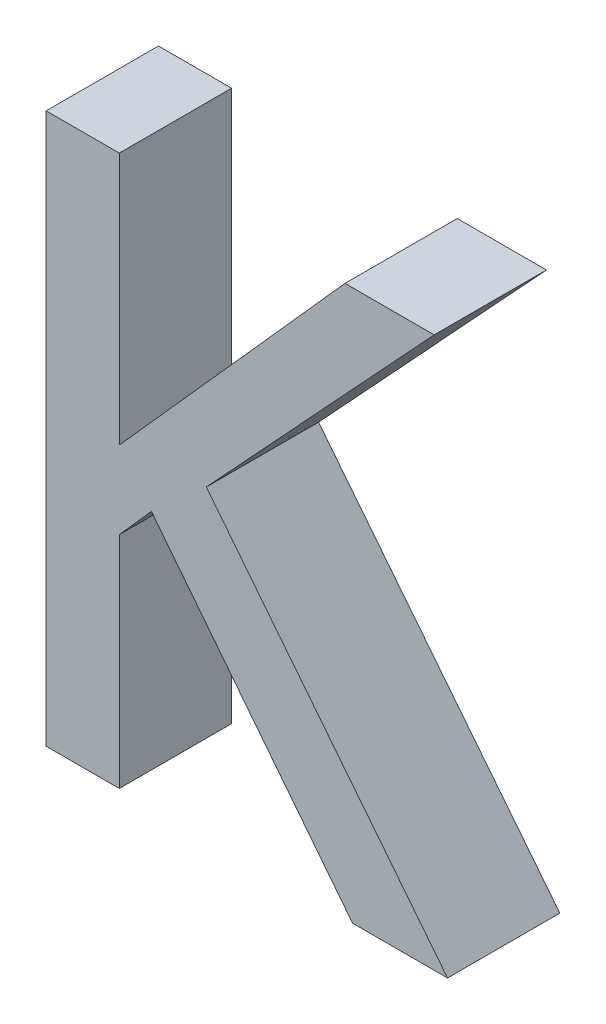
ISO-10303-21;
HEADER;
FILE_DESCRIPTION(('STEP AP214'),'2;1');
FILE_NAME('part.step','',(''),(''),'','','');
FILE_SCHEMA(('AUTOMOTIVE_DESIGN { 1 0 10303 214 1 1 1 1 }'));
ENDSEC;
DATA;
#1=APPLICATION_CONTEXT('core data for automotive mechanical design processes');
#2=APPLICATION_PROTOCOL_DEFINITION('international standard','automotive_design',2000,#1);
#3=PRODUCT_CONTEXT('',#1,'mechanical');
#4=PRODUCT('Part','Part','',(#3));
#5=PRODUCT_RELATED_PRODUCT_CATEGORY('part','',(#4));
#6=PRODUCT_DEFINITION_FORMATION('','',#4);
#7=PRODUCT_DEFINITION_CONTEXT('part definition',#1,'design');
#8=PRODUCT_DEFINITION('design','',#6,#7);
#9=PRODUCT_DEFINITION_SHAPE('','',#8);
#10=(LENGTH_UNIT() NAMED_UNIT(*) SI_UNIT(.MILLI.,.METRE.));
#11=(NAMED_UNIT(*) PLANE_ANGLE_UNIT() SI_UNIT($,.RADIAN.));
#12=(NAMED_UNIT(*) SI_UNIT($,.STERADIAN.) SOLID_ANGLE_UNIT());
#13=UNCERTAINTY_MEASURE_WITH_UNIT(LENGTH_MEASURE(1.E-05),#10,'distance_accuracy_value','');
#14=(GEOMETRIC_REPRESENTATION_CONTEXT(3) GLOBAL_UNCERTAINTY_ASSIGNED_CONTEXT((#13)) GLOBAL_UNIT_ASSIGNED_CONTEXT((#10,
#11,#12)) REPRESENTATION_CONTEXT('',''));
#15=CARTESIAN_POINT('',(0.,0.,0.));
#16=DIRECTION('',(0.,0.,1.));
#17=DIRECTION('',(1.,0.,0.));
#18=AXIS2_PLACEMENT_3D('',#15,#16,#17);
#19=CARTESIAN_POINT('',(-0.0746386260347803,-1.099105900586,0.));
#20=DIRECTION('',(-0.786318338822423,-0.617821551931904,0.));
#21=DIRECTION('',(0.617821551931904,-0.786318338822423,0.));
#22=AXIS2_PLACEMENT_3D('',#19,#20,#21);
#23=PLANE('',#22);
#24=DIRECTION('',(-0.617821551931904,0.786318338822423,0.));
#25=VECTOR('',#24,1.);
#26=CARTESIAN_POINT('',(0.104445648049852,-1.32703134033,0.));
#27=LINE('',#26,#25);
#28=CARTESIAN_POINT('',(0.104445648049852,-1.32703134033,0.));
#29=VERTEX_POINT('',#28);
#30=CARTESIAN_POINT('',(-0.0746386260347803,-1.099105900586,0.));
#31=VERTEX_POINT('',#30);
#32=EDGE_CURVE('E11',#29,#31,#27,.T.);
#33=ORIENTED_EDGE('',*,*,#32,.F.);
#34=DIRECTION('',(0.,0.,1.));
#35=VECTOR('',#34,1.);
#36=CARTESIAN_POINT('',(0.104445648049852,-1.32703134033,0.));
#37=LINE('',#36,#35);
#38=CARTESIAN_POINT('',(0.104445648049852,-1.32703134033,0.1));
#39=VERTEX_POINT('',#38);
#40=EDGE_CURVE('E24',#29,#39,#37,.T.);
#41=ORIENTED_EDGE('',*,*,#40,.T.);
#42=DIRECTION('',(0.617821551931904,-0.786318338822423,0.));
#43=VECTOR('',#42,1.);
#44=CARTESIAN_POINT('',(0.104445648049852,-1.32703134033,0.1));
#45=LINE('',#44,#43);
#46=CARTESIAN_POINT('',(-0.0746386260347803,-1.099105900586,0.1));
#47=VERTEX_POINT('',#46);
#48=EDGE_CURVE('E124',#47,#39,#45,.T.);
#49=ORIENTED_EDGE('',*,*,#48,.F.);
#50=DIRECTION('',(0.,0.,1.));
#51=VECTOR('',#50,1.);
#52=CARTESIAN_POINT('',(-0.0746386260347803,-1.099105900586,0.));
#53=LINE('',#52,#51);
#54=EDGE_CURVE('E197',#31,#47,#53,.T.);
#55=ORIENTED_EDGE('',*,*,#54,.F.);
#56=EDGE_LOOP('',(#33,#41,#49,#55));
#57=FACE_BOUND('',#56,.T.);
#58=ADVANCED_FACE('F17',(#57),#23,.T.);
#59=CARTESIAN_POINT('',(-0.103228576664699,-1.131269595045,0.));
#60=DIRECTION('',(0.747409318683659,-0.664363838829921,0.));
#61=DIRECTION('',(0.664363838829921,0.747409318683659,0.));
#62=AXIS2_PLACEMENT_3D('',#59,#60,#61);
#63=PLANE('',#62);
#64=DIRECTION('',(-0.664363838829921,-0.747409318683659,0.));
#65=VECTOR('',#64,1.);
#66=CARTESIAN_POINT('',(-0.0746386260347803,-1.099105900586,0.));
#67=LINE('',#66,#65);
#68=CARTESIAN_POINT('',(-0.103228576664699,-1.131269595045,0.));
#69=VERTEX_POINT('',#68);
#70=EDGE_CURVE('E195',#31,#69,#67,.T.);
#71=ORIENTED_EDGE('',*,*,#70,.F.);
#72=ORIENTED_EDGE('',*,*,#54,.T.);
#73=DIRECTION('',(0.664363838829921,0.747409318683659,0.));
#74=VECTOR('',#73,1.);
#75=CARTESIAN_POINT('',(-0.0746386260347803,-1.099105900586,0.1));
#76=LINE('',#75,#74);
#77=CARTESIAN_POINT('',(-0.103228576664699,-1.131269595045,0.1));
#78=VERTEX_POINT('',#77);
#79=EDGE_CURVE('E193',#78,#47,#76,.T.);
#80=ORIENTED_EDGE('',*,*,#79,.F.);
#81=DIRECTION('',(0.,0.,1.));
#82=VECTOR('',#81,1.);
#83=CARTESIAN_POINT('',(-0.103228576664699,-1.131269595045,0.));
#84=LINE('',#83,#82);
#85=EDGE_CURVE('E190',#69,#78,#84,.T.);
#86=ORIENTED_EDGE('',*,*,#85,.F.);
#87=EDGE_LOOP('',(#71,#72,#80,#86));
#88=FACE_BOUND('',#87,.T.);
#89=ADVANCED_FACE('F235',(#88),#63,.T.);
#90=CARTESIAN_POINT('',(-0.103228576664699,-1.32703134033,0.));
#91=DIRECTION('',(1.,0.,0.));
#92=DIRECTION('',(0.,1.,0.));
#93=AXIS2_PLACEMENT_3D('',#90,#91,#92);
#94=PLANE('',#93);
#95=DIRECTION('',(0.,-1.,0.));
#96=VECTOR('',#95,1.);
#97=CARTESIAN_POINT('',(-0.103228576664699,-1.131269595045,0.));
#98=LINE('',#97,#96);
#99=CARTESIAN_POINT('',(-0.103228576664699,-1.32703134033,0.));
#100=VERTEX_POINT('',#99);
#101=EDGE_CURVE('E188',#69,#100,#98,.T.);
#102=ORIENTED_EDGE('',*,*,#101,.F.);
#103=ORIENTED_EDGE('',*,*,#85,.T.);
#104=DIRECTION('',(0.,1.,0.));
#105=VECTOR('',#104,1.);
#106=CARTESIAN_POINT('',(-0.103228576664699,-1.131269595045,0.1));
#107=LINE('',#106,#105);
#108=CARTESIAN_POINT('',(-0.103228576664699,-1.32703134033,0.1));
#109=VERTEX_POINT('',#108);
#110=EDGE_CURVE('E185',#109,#78,#107,.T.);
#111=ORIENTED_EDGE('',*,*,#110,.F.);
#112=DIRECTION('',(0.,0.,1.));
#113=VECTOR('',#112,1.);
#114=CARTESIAN_POINT('',(-0.103228576664699,-1.32703134033,0.));
#115=LINE('',#114,#113);
#116=EDGE_CURVE('E182',#100,#109,#115,.T.);
#117=ORIENTED_EDGE('',*,*,#116,.F.);
#118=EDGE_LOOP('',(#102,#103,#111,#117));
#119=FACE_BOUND('',#118,.T.);
#120=ADVANCED_FACE('F231',(#119),#94,.T.);
#121=CARTESIAN_POINT('',(-0.168350130877293,-1.32703134033,0.));
#122=DIRECTION('',(0.,-1.,0.));
#123=DIRECTION('',(1.,0.,0.));
#124=AXIS2_PLACEMENT_3D('',#121,#122,#123);
#125=PLANE('',#124);
#126=DIRECTION('',(-1.,0.,0.));
#127=VECTOR('',#126,1.);
#128=CARTESIAN_POINT('',(-0.103228576664699,-1.32703134033,0.));
#129=LINE('',#128,#127);
#130=CARTESIAN_POINT('',(-0.168350130877293,-1.32703134033,0.));
#131=VERTEX_POINT('',#130);
#132=EDGE_CURVE('E180',#100,#131,#129,.T.);
#133=ORIENTED_EDGE('',*,*,#132,.F.);
#134=ORIENTED_EDGE('',*,*,#116,.T.);
#135=DIRECTION('',(1.,0.,0.));
#136=VECTOR('',#135,1.);
#137=CARTESIAN_POINT('',(-0.103228576664699,-1.32703134033,0.1));
#138=LINE('',#137,#136);
#139=CARTESIAN_POINT('',(-0.168350130877293,-1.32703134033,0.1));
#140=VERTEX_POINT('',#139);
#141=EDGE_CURVE('E177',#140,#109,#138,.T.);
#142=ORIENTED_EDGE('',*,*,#141,.F.);
#143=DIRECTION('',(0.,0.,1.));
#144=VECTOR('',#143,1.);
#145=CARTESIAN_POINT('',(-0.168350130877293,-1.32703134033,0.));
#146=LINE('',#145,#144);
#147=EDGE_CURVE('E174',#131,#140,#146,.T.);
#148=ORIENTED_EDGE('',*,*,#147,.F.);
#149=EDGE_LOOP('',(#133,#134,#142,#148));
#150=FACE_BOUND('',#149,.T.);
#151=ADVANCED_FACE('F227',(#150),#125,.T.);
#152=CARTESIAN_POINT('',(-0.168350130877293,-0.837031353145417,0.));
#153=DIRECTION('',(-1.,0.,0.));
#154=DIRECTION('',(0.,-1.,0.));
#155=AXIS2_PLACEMENT_3D('',#152,#153,#154);
#156=PLANE('',#155);
#157=DIRECTION('',(0.,1.,0.));
#158=VECTOR('',#157,1.);
#159=CARTESIAN_POINT('',(-0.168350130877293,-1.32703134033,0.));
#160=LINE('',#159,#158);
#161=CARTESIAN_POINT('',(-0.168350130877293,-0.837031353145417,0.));
#162=VERTEX_POINT('',#161);
#163=EDGE_CURVE('E172',#131,#162,#160,.T.);
#164=ORIENTED_EDGE('',*,*,#163,.F.);
#165=ORIENTED_EDGE('',*,*,#147,.T.);
#166=DIRECTION('',(0.,-1.,0.));
#167=VECTOR('',#166,1.);
#168=CARTESIAN_POINT('',(-0.168350130877293,-1.32703134033,0.1));
#169=LINE('',#168,#167);
#170=CARTESIAN_POINT('',(-0.168350130877293,-0.837031353145417,0.1));
#171=VERTEX_POINT('',#170);
#172=EDGE_CURVE('E169',#171,#140,#169,.T.);
#173=ORIENTED_EDGE('',*,*,#172,.F.);
#174=DIRECTION('',(0.,0.,1.));
#175=VECTOR('',#174,1.);
#176=CARTESIAN_POINT('',(-0.168350130877293,-0.837031353145417,0.));
#177=LINE('',#176,#175);
#178=EDGE_CURVE('E166',#162,#171,#177,.T.);
#179=ORIENTED_EDGE('',*,*,#178,.F.);
#180=EDGE_LOOP('',(#164,#165,#173,#179));
#181=FACE_BOUND('',#180,.T.);
#182=ADVANCED_FACE('F223',(#181),#156,.T.);
#183=CARTESIAN_POINT('',(-0.103228576664699,-0.837031353145417,0.));
#184=DIRECTION('',(0.,1.,0.));
#185=DIRECTION('',(-1.,0.,0.));
#186=AXIS2_PLACEMENT_3D('',#183,#184,#185);
#187=PLANE('',#186);
#188=DIRECTION('',(1.,0.,0.));
#189=VECTOR('',#188,1.);
#190=CARTESIAN_POINT('',(-0.168350130877293,-0.837031353145417,0.));
#191=LINE('',#190,#189);
#192=CARTESIAN_POINT('',(-0.103228576664699,-0.837031353145417,0.));
#193=VERTEX_POINT('',#192);
#194=EDGE_CURVE('E164',#162,#193,#191,.T.);
#195=ORIENTED_EDGE('',*,*,#194,.F.);
#196=ORIENTED_EDGE('',*,*,#178,.T.);
#197=DIRECTION('',(-1.,0.,0.));
#198=VECTOR('',#197,1.);
#199=CARTESIAN_POINT('',(-0.168350130877293,-0.837031353145417,0.1));
#200=LINE('',#199,#198);
#201=CARTESIAN_POINT('',(-0.103228576664699,-0.837031353145417,0.1));
#202=VERTEX_POINT('',#201);
#203=EDGE_CURVE('E161',#202,#171,#200,.T.);
#204=ORIENTED_EDGE('',*,*,#203,.F.);
#205=DIRECTION('',(0.,0.,1.));
#206=VECTOR('',#205,1.);
#207=CARTESIAN_POINT('',(-0.103228576664699,-0.837031353145417,0.));
#208=LINE('',#207,#206);
#209=EDGE_CURVE('E158',#193,#202,#208,.T.);
#210=ORIENTED_EDGE('',*,*,#209,.F.);
#211=EDGE_LOOP('',(#195,#196,#204,#210));
#212=FACE_BOUND('',#211,.T.);
#213=ADVANCED_FACE('F219',(#212),#187,.T.);
#214=CARTESIAN_POINT('',(-0.103228576664699,-1.062177214356,0.));
#215=DIRECTION('',(1.,0.,0.));
#216=DIRECTION('',(0.,1.,0.));
#217=AXIS2_PLACEMENT_3D('',#214,#215,#216);
#218=PLANE('',#217);
#219=DIRECTION('',(0.,-1.,0.));
#220=VECTOR('',#219,1.);
#221=CARTESIAN_POINT('',(-0.103228576664699,-0.837031353145417,0.));
#222=LINE('',#221,#220);
#223=CARTESIAN_POINT('',(-0.103228576664699,-1.062177214356,0.));
#224=VERTEX_POINT('',#223);
#225=EDGE_CURVE('E156',#193,#224,#222,.T.);
#226=ORIENTED_EDGE('',*,*,#225,.F.);
#227=ORIENTED_EDGE('',*,*,#209,.T.);
#228=DIRECTION('',(0.,1.,0.));
#229=VECTOR('',#228,1.);
#230=CARTESIAN_POINT('',(-0.103228576664699,-0.837031353145417,0.1));
#231=LINE('',#230,#229);
#232=CARTESIAN_POINT('',(-0.103228576664699,-1.062177214356,0.1));
#233=VERTEX_POINT('',#232);
#234=EDGE_CURVE('E153',#233,#202,#231,.T.);
#235=ORIENTED_EDGE('',*,*,#234,.F.);
#236=DIRECTION('',(0.,0.,1.));
#237=VECTOR('',#236,1.);
#238=CARTESIAN_POINT('',(-0.103228576664699,-1.062177214356,0.));
#239=LINE('',#238,#237);
#240=EDGE_CURVE('E150',#224,#233,#239,.T.);
#241=ORIENTED_EDGE('',*,*,#240,.F.);
#242=EDGE_LOOP('',(#226,#227,#235,#241));
#243=FACE_BOUND('',#242,.T.);
#244=ADVANCED_FACE('F215',(#243),#218,.T.);
#245=CARTESIAN_POINT('',(0.0976952430400095,-0.837031353145417,0.));
#246=DIRECTION('',(-0.746101072885279,0.665832703491977,0.));
#247=DIRECTION('',(-0.665832703491977,-0.746101072885279,0.));
#248=AXIS2_PLACEMENT_3D('',#245,#246,#247);
#249=PLANE('',#248);
#250=DIRECTION('',(0.665832703491977,0.746101072885279,0.));
#251=VECTOR('',#250,1.);
#252=CARTESIAN_POINT('',(-0.103228576664699,-1.062177214356,0.));
#253=LINE('',#252,#251);
#254=CARTESIAN_POINT('',(0.0976952430400095,-0.837031353145417,0.));
#255=VERTEX_POINT('',#254);
#256=EDGE_CURVE('E148',#224,#255,#253,.T.);
#257=ORIENTED_EDGE('',*,*,#256,.F.);
#258=ORIENTED_EDGE('',*,*,#240,.T.);
#259=DIRECTION('',(-0.665832703491977,-0.746101072885279,0.));
#260=VECTOR('',#259,1.);
#261=CARTESIAN_POINT('',(-0.103228576664699,-1.062177214356,0.1));
#262=LINE('',#261,#260);
#263=CARTESIAN_POINT('',(0.0976952430400095,-0.837031353145417,0.1));
#264=VERTEX_POINT('',#263);
#265=EDGE_CURVE('E145',#264,#233,#262,.T.);
#266=ORIENTED_EDGE('',*,*,#265,.F.);
#267=DIRECTION('',(0.,0.,1.));
#268=VECTOR('',#267,1.);
#269=CARTESIAN_POINT('',(0.0976952430400095,-0.837031353145417,0.));
#270=LINE('',#269,#268);
#271=EDGE_CURVE('E142',#255,#264,#270,.T.);
#272=ORIENTED_EDGE('',*,*,#271,.F.);
#273=EDGE_LOOP('',(#257,#258,#266,#272));
#274=FACE_BOUND('',#273,.T.);
#275=ADVANCED_FACE('F211',(#274),#249,.T.);
#276=CARTESIAN_POINT('',(0.177111772567562,-0.837031353145417,0.));
#277=DIRECTION('',(0.,1.,0.));
#278=DIRECTION('',(-1.,0.,0.));
#279=AXIS2_PLACEMENT_3D('',#276,#277,#278);
#280=PLANE('',#279);
#281=DIRECTION('',(1.,0.,0.));
#282=VECTOR('',#281,1.);
#283=CARTESIAN_POINT('',(0.0976952430400095,-0.837031353145417,0.));
#284=LINE('',#283,#282);
#285=CARTESIAN_POINT('',(0.177111772567562,-0.837031353145417,0.));
#286=VERTEX_POINT('',#285);
#287=EDGE_CURVE('E140',#255,#286,#284,.T.);
#288=ORIENTED_EDGE('',*,*,#287,.F.);
#289=ORIENTED_EDGE('',*,*,#271,.T.);
#290=DIRECTION('',(-1.,0.,0.));
#291=VECTOR('',#290,1.);
#292=CARTESIAN_POINT('',(0.0976952430400095,-0.837031353145417,0.1));
#293=LINE('',#292,#291);
#294=CARTESIAN_POINT('',(0.177111772567562,-0.837031353145417,0.1));
#295=VERTEX_POINT('',#294);
#296=EDGE_CURVE('E137',#295,#264,#293,.T.);
#297=ORIENTED_EDGE('',*,*,#296,.F.);
#298=DIRECTION('',(0.,0.,1.));
#299=VECTOR('',#298,1.);
#300=CARTESIAN_POINT('',(0.177111772567562,-0.837031353145417,0.));
#301=LINE('',#300,#299);
#302=EDGE_CURVE('E134',#286,#295,#301,.T.);
#303=ORIENTED_EDGE('',*,*,#302,.F.);
#304=EDGE_LOOP('',(#288,#289,#297,#303));
#305=FACE_BOUND('',#304,.T.);
#306=ADVANCED_FACE('F207',(#305),#280,.T.);
#307=CARTESIAN_POINT('',(-0.0257974603753352,-1.055823891994,0.));
#308=DIRECTION('',(0.73321990323995,-0.679991598104563,0.));
#309=DIRECTION('',(0.679991598104563,0.73321990323995,0.));
#310=AXIS2_PLACEMENT_3D('',#307,#308,#309);
#311=PLANE('',#310);
#312=DIRECTION('',(-0.679991598104563,-0.73321990323995,0.));
#313=VECTOR('',#312,1.);
#314=CARTESIAN_POINT('',(0.177111772567562,-0.837031353145417,0.));
#315=LINE('',#314,#313);
#316=CARTESIAN_POINT('',(-0.0257974603753352,-1.055823891994,0.));
#317=VERTEX_POINT('',#316);
#318=EDGE_CURVE('E132',#286,#317,#315,.T.);
#319=ORIENTED_EDGE('',*,*,#318,.F.);
#320=ORIENTED_EDGE('',*,*,#302,.T.);
#321=DIRECTION('',(0.679991598104563,0.73321990323995,0.));
#322=VECTOR('',#321,1.);
#323=CARTESIAN_POINT('',(0.177111772567562,-0.837031353145417,0.1));
#324=LINE('',#323,#322);
#325=CARTESIAN_POINT('',(-0.0257974603753352,-1.055823891994,0.1));
#326=VERTEX_POINT('',#325);
#327=EDGE_CURVE('E130',#326,#295,#324,.T.);
#328=ORIENTED_EDGE('',*,*,#327,.F.);
#329=DIRECTION('',(0.,0.,1.));
#330=VECTOR('',#329,1.);
#331=CARTESIAN_POINT('',(-0.0257974603753352,-1.055823891994,0.));
#332=LINE('',#331,#330);
#333=EDGE_CURVE('E109',#317,#326,#332,.T.);
#334=ORIENTED_EDGE('',*,*,#333,.F.);
#335=EDGE_LOOP('',(#319,#320,#328,#334));
#336=FACE_BOUND('',#335,.T.);
#337=ADVANCED_FACE('F205',(#336),#311,.T.);
#338=CARTESIAN_POINT('',(0.189024251996695,-1.32703134033,0.));
#339=DIRECTION('',(0.783882889412984,0.620908701570168,0.));
#340=DIRECTION('',(-0.620908701570168,0.783882889412984,0.));
#341=AXIS2_PLACEMENT_3D('',#338,#339,#340);
#342=PLANE('',#341);
#343=DIRECTION('',(0.620908701570168,-0.783882889412984,0.));
#344=VECTOR('',#343,1.);
#345=CARTESIAN_POINT('',(-0.0257974603753352,-1.055823891994,0.));
#346=LINE('',#345,#344);
#347=CARTESIAN_POINT('',(0.189024251996695,-1.32703134033,0.));
#348=VERTEX_POINT('',#347);
#349=EDGE_CURVE('E113',#317,#348,#346,.T.);
#350=ORIENTED_EDGE('',*,*,#349,.F.);
#351=ORIENTED_EDGE('',*,*,#333,.T.);
#352=DIRECTION('',(-0.620908701570168,0.783882889412984,0.));
#353=VECTOR('',#352,1.);
#354=CARTESIAN_POINT('',(-0.0257974603753352,-1.055823891994,0.1));
#355=LINE('',#354,#353);
#356=CARTESIAN_POINT('',(0.189024251996695,-1.32703134033,0.1));
#357=VERTEX_POINT('',#356);
#358=EDGE_CURVE('E102',#357,#326,#355,.T.);
#359=ORIENTED_EDGE('',*,*,#358,.F.);
#360=DIRECTION('',(0.,0.,1.));
#361=VECTOR('',#360,1.);
#362=CARTESIAN_POINT('',(0.189024251996695,-1.32703134033,0.));
#363=LINE('',#362,#361);
#364=EDGE_CURVE('E106',#348,#357,#363,.T.);
#365=ORIENTED_EDGE('',*,*,#364,.F.);
#366=EDGE_LOOP('',(#350,#351,#359,#365));
#367=FACE_BOUND('',#366,.T.);
#368=ADVANCED_FACE('F105',(#367),#342,.T.);
#369=CARTESIAN_POINT('',(0.104445648049852,-1.32703134033,0.));
#370=DIRECTION('',(0.,-1.,0.));
#371=DIRECTION('',(1.,0.,0.));
#372=AXIS2_PLACEMENT_3D('',#369,#370,#371);
#373=PLANE('',#372);
#374=DIRECTION('',(-1.,0.,0.));
#375=VECTOR('',#374,1.);
#376=CARTESIAN_POINT('',(0.189024251996695,-1.32703134033,0.));
#377=LINE('',#376,#375);
#378=EDGE_CURVE('E119',#348,#29,#377,.T.);
#379=ORIENTED_EDGE('',*,*,#378,.F.);
#380=ORIENTED_EDGE('',*,*,#364,.T.);
#381=DIRECTION('',(1.,0.,0.));
#382=VECTOR('',#381,1.);
#383=CARTESIAN_POINT('',(0.189024251996695,-1.32703134033,0.1));
#384=LINE('',#383,#382);
#385=EDGE_CURVE('E118',#39,#357,#384,.T.);
#386=ORIENTED_EDGE('',*,*,#385,.F.);
#387=ORIENTED_EDGE('',*,*,#40,.F.);
#388=EDGE_LOOP('',(#379,#380,#386,#387));
#389=FACE_BOUND('',#388,.T.);
#390=ADVANCED_FACE('F117',(#389),#373,.T.);
#391=CARTESIAN_POINT('',(-0.0281112297960724,-1.080856954555,0.));
#392=DIRECTION('',(0.,0.,1.));
#393=DIRECTION('',(1.,0.,0.));
#394=AXIS2_PLACEMENT_3D('',#391,#392,#393);
#395=PLANE('',#394);
#396=ORIENTED_EDGE('',*,*,#378,.T.);
#397=ORIENTED_EDGE('',*,*,#32,.T.);
#398=ORIENTED_EDGE('',*,*,#70,.T.);
#399=ORIENTED_EDGE('',*,*,#101,.T.);
#400=ORIENTED_EDGE('',*,*,#132,.T.);
#401=ORIENTED_EDGE('',*,*,#163,.T.);
#402=ORIENTED_EDGE('',*,*,#194,.T.);
#403=ORIENTED_EDGE('',*,*,#225,.T.);
#404=ORIENTED_EDGE('',*,*,#256,.T.);
#405=ORIENTED_EDGE('',*,*,#287,.T.);
#406=ORIENTED_EDGE('',*,*,#318,.T.);
#407=ORIENTED_EDGE('',*,*,#349,.T.);
#408=EDGE_LOOP('',(#396,#397,#398,#399,#400,#401,#402,#403,#404,#405,#406,#407));
#409=FACE_BOUND('',#408,.T.);
#410=ADVANCED_FACE('F200',(#409),#395,.F.);
#411=CARTESIAN_POINT('',(-0.0281112297960724,-1.080856954555,0.1));
#412=DIRECTION('',(0.,0.,1.));
#413=DIRECTION('',(1.,0.,0.));
#414=AXIS2_PLACEMENT_3D('',#411,#412,#413);
#415=PLANE('',#414);
#416=ORIENTED_EDGE('',*,*,#385,.T.);
#417=ORIENTED_EDGE('',*,*,#358,.T.);
#418=ORIENTED_EDGE('',*,*,#327,.T.);
#419=ORIENTED_EDGE('',*,*,#296,.T.);
#420=ORIENTED_EDGE('',*,*,#265,.T.);
#421=ORIENTED_EDGE('',*,*,#234,.T.);
#422=ORIENTED_EDGE('',*,*,#203,.T.);
#423=ORIENTED_EDGE('',*,*,#172,.T.);
#424=ORIENTED_EDGE('',*,*,#141,.T.);
#425=ORIENTED_EDGE('',*,*,#110,.T.);
#426=ORIENTED_EDGE('',*,*,#79,.T.);
#427=ORIENTED_EDGE('',*,*,#48,.T.);
#428=EDGE_LOOP('',(#416,#417,#418,#419,#420,#421,#422,#423,#424,#425,#426,#427));
#429=FACE_BOUND('',#428,.T.);
#430=ADVANCED_FACE('F122',(#429),#415,.T.);
#431=CLOSED_SHELL('',(#58,#89,#120,#151,#182,#213,#244,#275,#306,#337,#368,#390,#410,#430));
#432=MANIFOLD_SOLID_BREP('B1',#431);
#433=ADVANCED_BREP_SHAPE_REPRESENTATION('',(#18,#432),#14);
#434=SHAPE_DEFINITION_REPRESENTATION(#9,#433);
ENDSEC;
END-ISO-10303-21;
